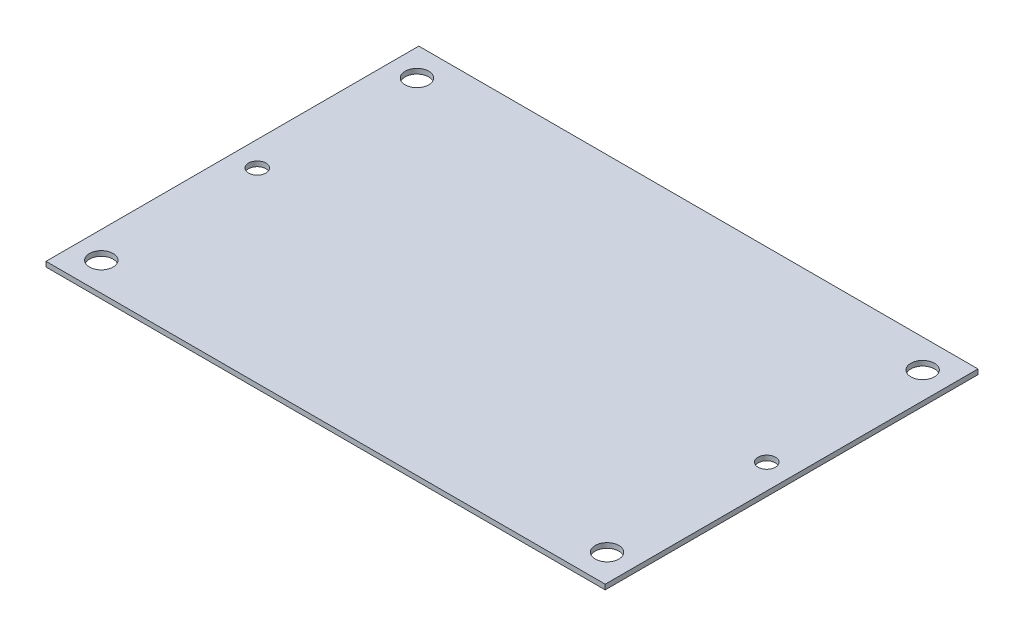
ISO-10303-21;
HEADER;
FILE_DESCRIPTION(('STEP AP214'),'2;1');
FILE_NAME('part.step','',(''),(''),'','','');
FILE_SCHEMA(('AUTOMOTIVE_DESIGN { 1 0 10303 214 1 1 1 1 }'));
ENDSEC;
DATA;
#1=APPLICATION_CONTEXT('core data for automotive mechanical design processes');
#2=APPLICATION_PROTOCOL_DEFINITION('international standard','automotive_design',2000,#1);
#3=PRODUCT_CONTEXT('',#1,'mechanical');
#4=PRODUCT('Part','Part','',(#3));
#5=PRODUCT_RELATED_PRODUCT_CATEGORY('part','',(#4));
#6=PRODUCT_DEFINITION_FORMATION('','',#4);
#7=PRODUCT_DEFINITION_CONTEXT('part definition',#1,'design');
#8=PRODUCT_DEFINITION('design','',#6,#7);
#9=PRODUCT_DEFINITION_SHAPE('','',#8);
#10=(LENGTH_UNIT() NAMED_UNIT(*) SI_UNIT(.MILLI.,.METRE.));
#11=(NAMED_UNIT(*) PLANE_ANGLE_UNIT() SI_UNIT($,.RADIAN.));
#12=(NAMED_UNIT(*) SI_UNIT($,.STERADIAN.) SOLID_ANGLE_UNIT());
#13=UNCERTAINTY_MEASURE_WITH_UNIT(LENGTH_MEASURE(1.E-05),#10,'distance_accuracy_value','');
#14=(GEOMETRIC_REPRESENTATION_CONTEXT(3) GLOBAL_UNCERTAINTY_ASSIGNED_CONTEXT((#13)) GLOBAL_UNIT_ASSIGNED_CONTEXT((#10,
#11,#12)) REPRESENTATION_CONTEXT('',''));
#15=CARTESIAN_POINT('',(0.,0.,0.));
#16=DIRECTION('',(0.,0.,1.));
#17=DIRECTION('',(1.,0.,0.));
#18=AXIS2_PLACEMENT_3D('',#15,#16,#17);
#19=CARTESIAN_POINT('',(0.,4.,0.));
#20=DIRECTION('',(1.,0.,0.));
#21=DIRECTION('',(0.,0.,-1.));
#22=AXIS2_PLACEMENT_3D('',#19,#20,#21);
#23=PLANE('',#22);
#24=DIRECTION('',(0.,0.,1.));
#25=VECTOR('',#24,1.);
#26=CARTESIAN_POINT('',(0.,0.,0.));
#27=LINE('',#26,#25);
#28=CARTESIAN_POINT('',(0.,0.,-300.));
#29=VERTEX_POINT('',#28);
#30=CARTESIAN_POINT('',(0.,0.,0.));
#31=VERTEX_POINT('',#30);
#32=EDGE_CURVE('E103',#29,#31,#27,.T.);
#33=ORIENTED_EDGE('',*,*,#32,.T.);
#34=DIRECTION('',(0.,-1.,0.));
#35=VECTOR('',#34,1.);
#36=CARTESIAN_POINT('',(0.,4.,0.));
#37=LINE('',#36,#35);
#38=CARTESIAN_POINT('',(0.,4.,0.));
#39=VERTEX_POINT('',#38);
#40=EDGE_CURVE('E11',#39,#31,#37,.T.);
#41=ORIENTED_EDGE('',*,*,#40,.F.);
#42=DIRECTION('',(0.,0.,1.));
#43=VECTOR('',#42,1.);
#44=CARTESIAN_POINT('',(0.,4.,0.));
#45=LINE('',#44,#43);
#46=CARTESIAN_POINT('',(0.,4.,-300.));
#47=VERTEX_POINT('',#46);
#48=EDGE_CURVE('E90',#47,#39,#45,.T.);
#49=ORIENTED_EDGE('',*,*,#48,.F.);
#50=DIRECTION('',(0.,-1.,0.));
#51=VECTOR('',#50,1.);
#52=CARTESIAN_POINT('',(0.,4.,-300.));
#53=LINE('',#52,#51);
#54=EDGE_CURVE('E99',#47,#29,#53,.T.);
#55=ORIENTED_EDGE('',*,*,#54,.T.);
#56=EDGE_LOOP('',(#33,#41,#49,#55));
#57=FACE_BOUND('',#56,.T.);
#58=ADVANCED_FACE('F37',(#57),#23,.F.);
#59=CARTESIAN_POINT('',(0.,4.,0.));
#60=DIRECTION('',(0.,0.,-1.));
#61=DIRECTION('',(-1.,0.,0.));
#62=AXIS2_PLACEMENT_3D('',#59,#60,#61);
#63=PLANE('',#62);
#64=DIRECTION('',(1.,0.,0.));
#65=VECTOR('',#64,1.);
#66=CARTESIAN_POINT('',(0.,0.,0.));
#67=LINE('',#66,#65);
#68=CARTESIAN_POINT('',(450.,0.,0.));
#69=VERTEX_POINT('',#68);
#70=EDGE_CURVE('E94',#31,#69,#67,.T.);
#71=ORIENTED_EDGE('',*,*,#70,.T.);
#72=DIRECTION('',(0.,-1.,0.));
#73=VECTOR('',#72,1.);
#74=CARTESIAN_POINT('',(450.,4.,0.));
#75=LINE('',#74,#73);
#76=CARTESIAN_POINT('',(450.,4.,0.));
#77=VERTEX_POINT('',#76);
#78=EDGE_CURVE('E46',#77,#69,#75,.T.);
#79=ORIENTED_EDGE('',*,*,#78,.F.);
#80=DIRECTION('',(1.,0.,0.));
#81=VECTOR('',#80,1.);
#82=CARTESIAN_POINT('',(0.,4.,0.));
#83=LINE('',#82,#81);
#84=EDGE_CURVE('E85',#39,#77,#83,.T.);
#85=ORIENTED_EDGE('',*,*,#84,.F.);
#86=ORIENTED_EDGE('',*,*,#40,.T.);
#87=EDGE_LOOP('',(#71,#79,#85,#86));
#88=FACE_BOUND('',#87,.T.);
#89=ADVANCED_FACE('F93',(#88),#63,.F.);
#90=CARTESIAN_POINT('',(450.,4.,0.));
#91=DIRECTION('',(-1.,0.,0.));
#92=DIRECTION('',(0.,0.,1.));
#93=AXIS2_PLACEMENT_3D('',#90,#91,#92);
#94=PLANE('',#93);
#95=DIRECTION('',(0.,0.,-1.));
#96=VECTOR('',#95,1.);
#97=CARTESIAN_POINT('',(450.,0.,0.));
#98=LINE('',#97,#96);
#99=CARTESIAN_POINT('',(450.,0.,-300.));
#100=VERTEX_POINT('',#99);
#101=EDGE_CURVE('E72',#69,#100,#98,.T.);
#102=ORIENTED_EDGE('',*,*,#101,.T.);
#103=DIRECTION('',(0.,-1.,0.));
#104=VECTOR('',#103,1.);
#105=CARTESIAN_POINT('',(450.,4.,-300.));
#106=LINE('',#105,#104);
#107=CARTESIAN_POINT('',(450.,4.,-300.));
#108=VERTEX_POINT('',#107);
#109=EDGE_CURVE('E95',#108,#100,#106,.T.);
#110=ORIENTED_EDGE('',*,*,#109,.F.);
#111=DIRECTION('',(0.,0.,-1.));
#112=VECTOR('',#111,1.);
#113=CARTESIAN_POINT('',(450.,4.,0.));
#114=LINE('',#113,#112);
#115=EDGE_CURVE('E88',#77,#108,#114,.T.);
#116=ORIENTED_EDGE('',*,*,#115,.F.);
#117=ORIENTED_EDGE('',*,*,#78,.T.);
#118=EDGE_LOOP('',(#102,#110,#116,#117));
#119=FACE_BOUND('',#118,.T.);
#120=ADVANCED_FACE('F97',(#119),#94,.F.);
#121=CARTESIAN_POINT('',(0.,4.,-300.));
#122=DIRECTION('',(0.,0.,1.));
#123=DIRECTION('',(1.,0.,0.));
#124=AXIS2_PLACEMENT_3D('',#121,#122,#123);
#125=PLANE('',#124);
#126=DIRECTION('',(-1.,0.,0.));
#127=VECTOR('',#126,1.);
#128=CARTESIAN_POINT('',(0.,0.,-300.));
#129=LINE('',#128,#127);
#130=EDGE_CURVE('E78',#100,#29,#129,.T.);
#131=ORIENTED_EDGE('',*,*,#130,.T.);
#132=ORIENTED_EDGE('',*,*,#54,.F.);
#133=DIRECTION('',(-1.,0.,0.));
#134=VECTOR('',#133,1.);
#135=CARTESIAN_POINT('',(0.,4.,-300.));
#136=LINE('',#135,#134);
#137=EDGE_CURVE('E55',#108,#47,#136,.T.);
#138=ORIENTED_EDGE('',*,*,#137,.F.);
#139=ORIENTED_EDGE('',*,*,#109,.T.);
#140=EDGE_LOOP('',(#131,#132,#138,#139));
#141=FACE_BOUND('',#140,.T.);
#142=ADVANCED_FACE('F156',(#141),#125,.F.);
#143=CARTESIAN_POINT('',(0.,4.,0.));
#144=DIRECTION('',(0.,-1.,0.));
#145=DIRECTION('',(0.,0.,-1.));
#146=AXIS2_PLACEMENT_3D('',#143,#144,#145);
#147=PLANE('',#146);
#148=CARTESIAN_POINT('',(21.4999999999998,4.,-23.0000000000002));
#149=DIRECTION('',(0.,1.,0.));
#150=DIRECTION('',(0.,0.,1.));
#151=AXIS2_PLACEMENT_3D('',#148,#149,#150);
#152=CIRCLE('',#151,9.49999999999998);
#153=CARTESIAN_POINT('',(21.4999999999998,4.,-13.5000000000003));
#154=VERTEX_POINT('',#153);
#155=EDGE_CURVE('E119',#154,#154,#152,.T.);
#156=ORIENTED_EDGE('',*,*,#155,.F.);
#157=EDGE_LOOP('',(#156));
#158=FACE_BOUND('',#157,.T.);
#159=CARTESIAN_POINT('',(428.5,4.,-23.0000000000004));
#160=DIRECTION('',(0.,1.,0.));
#161=DIRECTION('',(0.,0.,1.));
#162=AXIS2_PLACEMENT_3D('',#159,#160,#161);
#163=CIRCLE('',#162,9.50000000000001);
#164=CARTESIAN_POINT('',(428.5,4.,-13.5000000000003));
#165=VERTEX_POINT('',#164);
#166=EDGE_CURVE('E145',#165,#165,#163,.T.);
#167=ORIENTED_EDGE('',*,*,#166,.F.);
#168=EDGE_LOOP('',(#167));
#169=FACE_BOUND('',#168,.T.);
#170=CARTESIAN_POINT('',(430.,4.,-150.000000000001));
#171=DIRECTION('',(0.,1.,0.));
#172=DIRECTION('',(0.,0.,1.));
#173=AXIS2_PLACEMENT_3D('',#170,#171,#172);
#174=CIRCLE('',#173,7.00000000000004);
#175=CARTESIAN_POINT('',(430.,4.,-143.000000000001));
#176=VERTEX_POINT('',#175);
#177=EDGE_CURVE('E142',#176,#176,#174,.T.);
#178=ORIENTED_EDGE('',*,*,#177,.F.);
#179=EDGE_LOOP('',(#178));
#180=FACE_BOUND('',#179,.T.);
#181=CARTESIAN_POINT('',(428.5,4.,-277.000000000002));
#182=DIRECTION('',(0.,1.,0.));
#183=DIRECTION('',(0.,0.,1.));
#184=AXIS2_PLACEMENT_3D('',#181,#182,#183);
#185=CIRCLE('',#184,9.50000000000001);
#186=CARTESIAN_POINT('',(428.5,4.,-267.500000000002));
#187=VERTEX_POINT('',#186);
#188=EDGE_CURVE('E139',#187,#187,#185,.T.);
#189=ORIENTED_EDGE('',*,*,#188,.F.);
#190=EDGE_LOOP('',(#189));
#191=FACE_BOUND('',#190,.T.);
#192=CARTESIAN_POINT('',(21.5,4.,-277.000000000002));
#193=DIRECTION('',(0.,1.,0.));
#194=DIRECTION('',(0.,0.,1.));
#195=AXIS2_PLACEMENT_3D('',#192,#193,#194);
#196=CIRCLE('',#195,9.50000000000001);
#197=CARTESIAN_POINT('',(21.5,4.,-267.500000000002));
#198=VERTEX_POINT('',#197);
#199=EDGE_CURVE('E136',#198,#198,#196,.T.);
#200=ORIENTED_EDGE('',*,*,#199,.F.);
#201=EDGE_LOOP('',(#200));
#202=FACE_BOUND('',#201,.T.);
#203=CARTESIAN_POINT('',(19.9999999999999,4.,-150.));
#204=DIRECTION('',(0.,1.,0.));
#205=DIRECTION('',(0.,0.,1.));
#206=AXIS2_PLACEMENT_3D('',#203,#204,#205);
#207=CIRCLE('',#206,7.00000000000002);
#208=CARTESIAN_POINT('',(19.9999999999999,4.,-143.));
#209=VERTEX_POINT('',#208);
#210=EDGE_CURVE('E114',#209,#209,#207,.T.);
#211=ORIENTED_EDGE('',*,*,#210,.F.);
#212=EDGE_LOOP('',(#211));
#213=FACE_BOUND('',#212,.T.);
#214=ORIENTED_EDGE('',*,*,#48,.T.);
#215=ORIENTED_EDGE('',*,*,#84,.T.);
#216=ORIENTED_EDGE('',*,*,#115,.T.);
#217=ORIENTED_EDGE('',*,*,#137,.T.);
#218=EDGE_LOOP('',(#214,#215,#216,#217));
#219=FACE_BOUND('',#218,.T.);
#220=ADVANCED_FACE('F86',(#158,#169,#180,#191,#202,#213,#219),#147,.F.);
#221=CARTESIAN_POINT('',(0.,0.,0.));
#222=DIRECTION('',(0.,-1.,0.));
#223=DIRECTION('',(0.,0.,-1.));
#224=AXIS2_PLACEMENT_3D('',#221,#222,#223);
#225=PLANE('',#224);
#226=CARTESIAN_POINT('',(21.4999999999998,0.,-23.0000000000002));
#227=DIRECTION('',(0.,-1.,0.));
#228=DIRECTION('',(0.,0.,-1.));
#229=AXIS2_PLACEMENT_3D('',#226,#227,#228);
#230=CIRCLE('',#229,9.49999999999998);
#231=CARTESIAN_POINT('',(21.4999999999998,0.,-32.5000000000002));
#232=VERTEX_POINT('',#231);
#233=EDGE_CURVE('E40',#232,#232,#230,.T.);
#234=ORIENTED_EDGE('',*,*,#233,.F.);
#235=EDGE_LOOP('',(#234));
#236=FACE_BOUND('',#235,.T.);
#237=CARTESIAN_POINT('',(428.5,0.,-23.0000000000004));
#238=DIRECTION('',(0.,-1.,0.));
#239=DIRECTION('',(0.,0.,-1.));
#240=AXIS2_PLACEMENT_3D('',#237,#238,#239);
#241=CIRCLE('',#240,9.50000000000001);
#242=CARTESIAN_POINT('',(428.5,0.,-32.5000000000004));
#243=VERTEX_POINT('',#242);
#244=EDGE_CURVE('E124',#243,#243,#241,.T.);
#245=ORIENTED_EDGE('',*,*,#244,.F.);
#246=EDGE_LOOP('',(#245));
#247=FACE_BOUND('',#246,.T.);
#248=CARTESIAN_POINT('',(430.,0.,-150.000000000001));
#249=DIRECTION('',(0.,-1.,0.));
#250=DIRECTION('',(0.,0.,-1.));
#251=AXIS2_PLACEMENT_3D('',#248,#249,#250);
#252=CIRCLE('',#251,7.00000000000004);
#253=CARTESIAN_POINT('',(430.,0.,-157.000000000001));
#254=VERTEX_POINT('',#253);
#255=EDGE_CURVE('E122',#254,#254,#252,.T.);
#256=ORIENTED_EDGE('',*,*,#255,.F.);
#257=EDGE_LOOP('',(#256));
#258=FACE_BOUND('',#257,.T.);
#259=CARTESIAN_POINT('',(428.5,0.,-277.000000000002));
#260=DIRECTION('',(0.,-1.,0.));
#261=DIRECTION('',(0.,0.,-1.));
#262=AXIS2_PLACEMENT_3D('',#259,#260,#261);
#263=CIRCLE('',#262,9.50000000000001);
#264=CARTESIAN_POINT('',(428.5,0.,-286.500000000002));
#265=VERTEX_POINT('',#264);
#266=EDGE_CURVE('E118',#265,#265,#263,.T.);
#267=ORIENTED_EDGE('',*,*,#266,.F.);
#268=EDGE_LOOP('',(#267));
#269=FACE_BOUND('',#268,.T.);
#270=CARTESIAN_POINT('',(21.5,0.,-277.000000000002));
#271=DIRECTION('',(0.,-1.,0.));
#272=DIRECTION('',(0.,0.,-1.));
#273=AXIS2_PLACEMENT_3D('',#270,#271,#272);
#274=CIRCLE('',#273,9.50000000000001);
#275=CARTESIAN_POINT('',(21.5,0.,-286.500000000002));
#276=VERTEX_POINT('',#275);
#277=EDGE_CURVE('E115',#276,#276,#274,.T.);
#278=ORIENTED_EDGE('',*,*,#277,.F.);
#279=EDGE_LOOP('',(#278));
#280=FACE_BOUND('',#279,.T.);
#281=CARTESIAN_POINT('',(19.9999999999999,0.,-150.));
#282=DIRECTION('',(0.,-1.,0.));
#283=DIRECTION('',(0.,0.,-1.));
#284=AXIS2_PLACEMENT_3D('',#281,#282,#283);
#285=CIRCLE('',#284,7.00000000000002);
#286=CARTESIAN_POINT('',(19.9999999999999,0.,-157.));
#287=VERTEX_POINT('',#286);
#288=EDGE_CURVE('E106',#287,#287,#285,.T.);
#289=ORIENTED_EDGE('',*,*,#288,.F.);
#290=EDGE_LOOP('',(#289));
#291=FACE_BOUND('',#290,.T.);
#292=ORIENTED_EDGE('',*,*,#32,.F.);
#293=ORIENTED_EDGE('',*,*,#130,.F.);
#294=ORIENTED_EDGE('',*,*,#101,.F.);
#295=ORIENTED_EDGE('',*,*,#70,.F.);
#296=EDGE_LOOP('',(#292,#293,#294,#295));
#297=FACE_BOUND('',#296,.T.);
#298=ADVANCED_FACE('F155',(#236,#247,#258,#269,#280,#291,#297),#225,.T.);
#299=CARTESIAN_POINT('',(19.9999999999999,-6.,-150.));
#300=DIRECTION('',(0.,1.,0.));
#301=DIRECTION('',(0.,0.,1.));
#302=AXIS2_PLACEMENT_3D('',#299,#300,#301);
#303=CYLINDRICAL_SURFACE('',#302,7.00000000000002);
#304=ORIENTED_EDGE('',*,*,#288,.T.);
#305=EDGE_LOOP('',(#304));
#306=FACE_BOUND('',#305,.T.);
#307=ORIENTED_EDGE('',*,*,#210,.T.);
#308=EDGE_LOOP('',(#307));
#309=FACE_BOUND('',#308,.T.);
#310=ADVANCED_FACE('F170',(#306,#309),#303,.F.);
#311=CARTESIAN_POINT('',(21.5,-6.,-277.000000000002));
#312=DIRECTION('',(0.,1.,0.));
#313=DIRECTION('',(0.,0.,1.));
#314=AXIS2_PLACEMENT_3D('',#311,#312,#313);
#315=CYLINDRICAL_SURFACE('',#314,9.50000000000001);
#316=ORIENTED_EDGE('',*,*,#277,.T.);
#317=EDGE_LOOP('',(#316));
#318=FACE_BOUND('',#317,.T.);
#319=ORIENTED_EDGE('',*,*,#199,.T.);
#320=EDGE_LOOP('',(#319));
#321=FACE_BOUND('',#320,.T.);
#322=ADVANCED_FACE('F167',(#318,#321),#315,.F.);
#323=CARTESIAN_POINT('',(428.5,-6.,-277.000000000002));
#324=DIRECTION('',(0.,1.,0.));
#325=DIRECTION('',(0.,0.,1.));
#326=AXIS2_PLACEMENT_3D('',#323,#324,#325);
#327=CYLINDRICAL_SURFACE('',#326,9.50000000000001);
#328=ORIENTED_EDGE('',*,*,#266,.T.);
#329=EDGE_LOOP('',(#328));
#330=FACE_BOUND('',#329,.T.);
#331=ORIENTED_EDGE('',*,*,#188,.T.);
#332=EDGE_LOOP('',(#331));
#333=FACE_BOUND('',#332,.T.);
#334=ADVANCED_FACE('F169',(#330,#333),#327,.F.);
#335=CARTESIAN_POINT('',(430.,-6.,-150.000000000001));
#336=DIRECTION('',(0.,1.,0.));
#337=DIRECTION('',(0.,0.,1.));
#338=AXIS2_PLACEMENT_3D('',#335,#336,#337);
#339=CYLINDRICAL_SURFACE('',#338,7.00000000000004);
#340=ORIENTED_EDGE('',*,*,#255,.T.);
#341=EDGE_LOOP('',(#340));
#342=FACE_BOUND('',#341,.T.);
#343=ORIENTED_EDGE('',*,*,#177,.T.);
#344=EDGE_LOOP('',(#343));
#345=FACE_BOUND('',#344,.T.);
#346=ADVANCED_FACE('F177',(#342,#345),#339,.F.);
#347=CARTESIAN_POINT('',(428.5,-6.,-23.0000000000004));
#348=DIRECTION('',(0.,1.,0.));
#349=DIRECTION('',(0.,0.,1.));
#350=AXIS2_PLACEMENT_3D('',#347,#348,#349);
#351=CYLINDRICAL_SURFACE('',#350,9.50000000000001);
#352=ORIENTED_EDGE('',*,*,#244,.T.);
#353=EDGE_LOOP('',(#352));
#354=FACE_BOUND('',#353,.T.);
#355=ORIENTED_EDGE('',*,*,#166,.T.);
#356=EDGE_LOOP('',(#355));
#357=FACE_BOUND('',#356,.T.);
#358=ADVANCED_FACE('F240',(#354,#357),#351,.F.);
#359=CARTESIAN_POINT('',(21.4999999999998,-6.,-23.0000000000002));
#360=DIRECTION('',(0.,1.,0.));
#361=DIRECTION('',(0.,0.,1.));
#362=AXIS2_PLACEMENT_3D('',#359,#360,#361);
#363=CYLINDRICAL_SURFACE('',#362,9.49999999999998);
#364=ORIENTED_EDGE('',*,*,#233,.T.);
#365=EDGE_LOOP('',(#364));
#366=FACE_BOUND('',#365,.T.);
#367=ORIENTED_EDGE('',*,*,#155,.T.);
#368=EDGE_LOOP('',(#367));
#369=FACE_BOUND('',#368,.T.);
#370=ADVANCED_FACE('F151',(#366,#369),#363,.F.);
#371=CLOSED_SHELL('',(#58,#89,#120,#142,#220,#298,#310,#322,#334,#346,#358,#370));
#372=MANIFOLD_SOLID_BREP('B2',#371);
#373=ADVANCED_BREP_SHAPE_REPRESENTATION('',(#18,#372),#14);
#374=SHAPE_DEFINITION_REPRESENTATION(#9,#373);
ENDSEC;
END-ISO-10303-21;
